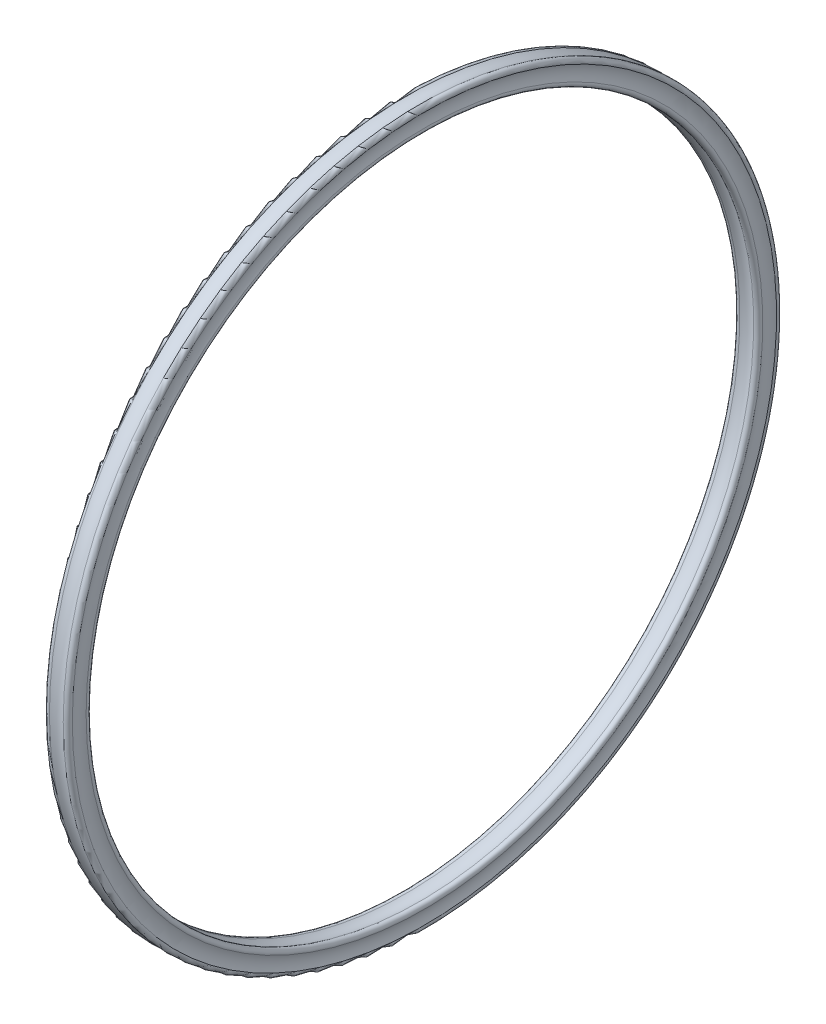
ISO-10303-21;
HEADER;
FILE_DESCRIPTION(('STEP AP214'),'2;1');
FILE_NAME('part.step','',(''),(''),'','','');
FILE_SCHEMA(('AUTOMOTIVE_DESIGN { 1 0 10303 214 1 1 1 1 }'));
ENDSEC;
DATA;
#1=APPLICATION_CONTEXT('core data for automotive mechanical design processes');
#2=APPLICATION_PROTOCOL_DEFINITION('international standard','automotive_design',2000,#1);
#3=PRODUCT_CONTEXT('',#1,'mechanical');
#4=PRODUCT('Part','Part','',(#3));
#5=PRODUCT_RELATED_PRODUCT_CATEGORY('part','',(#4));
#6=PRODUCT_DEFINITION_FORMATION('','',#4);
#7=PRODUCT_DEFINITION_CONTEXT('part definition',#1,'design');
#8=PRODUCT_DEFINITION('design','',#6,#7);
#9=PRODUCT_DEFINITION_SHAPE('','',#8);
#10=(LENGTH_UNIT() NAMED_UNIT(*) SI_UNIT(.MILLI.,.METRE.));
#11=(NAMED_UNIT(*) PLANE_ANGLE_UNIT() SI_UNIT($,.RADIAN.));
#12=(NAMED_UNIT(*) SI_UNIT($,.STERADIAN.) SOLID_ANGLE_UNIT());
#13=UNCERTAINTY_MEASURE_WITH_UNIT(LENGTH_MEASURE(1.E-05),#10,'distance_accuracy_value','');
#14=(GEOMETRIC_REPRESENTATION_CONTEXT(3) GLOBAL_UNCERTAINTY_ASSIGNED_CONTEXT((#13)) GLOBAL_UNIT_ASSIGNED_CONTEXT((#10,
#11,#12)) REPRESENTATION_CONTEXT('',''));
#15=CARTESIAN_POINT('',(0.,0.,0.));
#16=DIRECTION('',(0.,0.,1.));
#17=DIRECTION('',(1.,0.,0.));
#18=AXIS2_PLACEMENT_3D('',#15,#16,#17);
#19=CARTESIAN_POINT('',(-0.62861792847484,0.,0.));
#20=DIRECTION('',(-1.,0.,0.));
#21=DIRECTION('',(0.,0.,1.));
#22=AXIS2_PLACEMENT_3D('',#19,#20,#21);
#23=TOROIDAL_SURFACE('',#22,26.7779179284748,0.260382071525161);
#24=CARTESIAN_POINT('',(-0.8665747498208,0.,0.));
#25=DIRECTION('',(-1.,0.,0.));
#26=DIRECTION('',(0.,0.,1.));
#27=AXIS2_PLACEMENT_3D('',#24,#25,#26);
#28=CIRCLE('',#27,26.6722042853314);
#29=CARTESIAN_POINT('',(-0.8665747498208,0.,26.6722042853314));
#30=VERTEX_POINT('',#29);
#31=EDGE_CURVE('E58',#30,#30,#28,.T.);
#32=ORIENTED_EDGE('',*,*,#31,.F.);
#33=EDGE_LOOP('',(#32));
#34=FACE_BOUND('',#33,.T.);
#35=CARTESIAN_POINT('',(-0.522904285331392,0.,0.));
#36=DIRECTION('',(-1.,0.,0.));
#37=DIRECTION('',(0.,0.,1.));
#38=AXIS2_PLACEMENT_3D('',#35,#36,#37);
#39=CIRCLE('',#38,27.0158747498208);
#40=CARTESIAN_POINT('',(-0.522904285331392,0.,27.0158747498208));
#41=VERTEX_POINT('',#40);
#42=EDGE_CURVE('E10',#41,#41,#39,.T.);
#43=ORIENTED_EDGE('',*,*,#42,.T.);
#44=EDGE_LOOP('',(#43));
#45=FACE_BOUND('',#44,.T.);
#46=ADVANCED_FACE('F30',(#34,#45),#23,.T.);
#47=CARTESIAN_POINT('',(0.,0.,0.));
#48=DIRECTION('',(-1.,0.,0.));
#49=DIRECTION('',(0.,0.,1.));
#50=AXIS2_PLACEMENT_3D('',#47,#48,#49);
#51=TOROIDAL_SURFACE('',#50,28.1929095951415,1.28795959514152);
#52=ORIENTED_EDGE('',*,*,#42,.F.);
#53=EDGE_LOOP('',(#52));
#54=FACE_BOUND('',#53,.T.);
#55=CARTESIAN_POINT('',(0.522904285331394,0.,0.));
#56=DIRECTION('',(-1.,0.,0.));
#57=DIRECTION('',(0.,0.,1.));
#58=AXIS2_PLACEMENT_3D('',#55,#56,#57);
#59=CIRCLE('',#58,27.0158747498208);
#60=CARTESIAN_POINT('',(0.522904285331394,0.,27.0158747498208));
#61=VERTEX_POINT('',#60);
#62=EDGE_CURVE('E36',#61,#61,#59,.T.);
#63=ORIENTED_EDGE('',*,*,#62,.T.);
#64=EDGE_LOOP('',(#63));
#65=FACE_BOUND('',#64,.T.);
#66=ADVANCED_FACE('F65',(#54,#65),#51,.F.);
#67=CARTESIAN_POINT('',(0.628617928474841,0.,0.));
#68=DIRECTION('',(-1.,0.,0.));
#69=DIRECTION('',(0.,0.,1.));
#70=AXIS2_PLACEMENT_3D('',#67,#68,#69);
#71=TOROIDAL_SURFACE('',#70,26.7779179284748,0.260382071525159);
#72=ORIENTED_EDGE('',*,*,#62,.F.);
#73=EDGE_LOOP('',(#72));
#74=FACE_BOUND('',#73,.T.);
#75=CARTESIAN_POINT('',(0.866574749820801,0.,0.));
#76=DIRECTION('',(-1.,0.,0.));
#77=DIRECTION('',(0.,0.,1.));
#78=AXIS2_PLACEMENT_3D('',#75,#76,#77);
#79=CIRCLE('',#78,26.6722042853314);
#80=CARTESIAN_POINT('',(0.866574749820801,0.,26.6722042853314));
#81=VERTEX_POINT('',#80);
#82=EDGE_CURVE('E40',#81,#81,#79,.T.);
#83=ORIENTED_EDGE('',*,*,#82,.T.);
#84=EDGE_LOOP('',(#83));
#85=FACE_BOUND('',#84,.T.);
#86=ADVANCED_FACE('F69',(#74,#85),#71,.T.);
#87=CARTESIAN_POINT('',(2.04360959514152,0.,0.));
#88=DIRECTION('',(-1.,0.,0.));
#89=DIRECTION('',(0.,0.,1.));
#90=AXIS2_PLACEMENT_3D('',#87,#88,#89);
#91=TOROIDAL_SURFACE('',#90,26.1493,1.28795959514152);
#92=ORIENTED_EDGE('',*,*,#82,.F.);
#93=EDGE_LOOP('',(#92));
#94=FACE_BOUND('',#93,.T.);
#95=CARTESIAN_POINT('',(0.866574749820801,0.,0.));
#96=DIRECTION('',(-1.,0.,0.));
#97=DIRECTION('',(0.,0.,1.));
#98=AXIS2_PLACEMENT_3D('',#95,#96,#97);
#99=CIRCLE('',#98,25.6263957146686);
#100=CARTESIAN_POINT('',(0.866574749820801,0.,25.6263957146686));
#101=VERTEX_POINT('',#100);
#102=EDGE_CURVE('E44',#101,#101,#99,.T.);
#103=ORIENTED_EDGE('',*,*,#102,.T.);
#104=EDGE_LOOP('',(#103));
#105=FACE_BOUND('',#104,.T.);
#106=ADVANCED_FACE('F74',(#94,#105),#91,.F.);
#107=CARTESIAN_POINT('',(0.628617928474841,0.,0.));
#108=DIRECTION('',(-1.,0.,0.));
#109=DIRECTION('',(0.,0.,1.));
#110=AXIS2_PLACEMENT_3D('',#107,#108,#109);
#111=TOROIDAL_SURFACE('',#110,25.5206820715252,0.26038207152516);
#112=ORIENTED_EDGE('',*,*,#102,.F.);
#113=EDGE_LOOP('',(#112));
#114=FACE_BOUND('',#113,.T.);
#115=CARTESIAN_POINT('',(0.522904285331393,0.,0.));
#116=DIRECTION('',(-1.,0.,0.));
#117=DIRECTION('',(0.,0.,1.));
#118=AXIS2_PLACEMENT_3D('',#115,#116,#117);
#119=CIRCLE('',#118,25.2827252501792);
#120=CARTESIAN_POINT('',(0.522904285331393,0.,25.2827252501792));
#121=VERTEX_POINT('',#120);
#122=EDGE_CURVE('E49',#121,#121,#119,.T.);
#123=ORIENTED_EDGE('',*,*,#122,.T.);
#124=EDGE_LOOP('',(#123));
#125=FACE_BOUND('',#124,.T.);
#126=ADVANCED_FACE('F80',(#114,#125),#111,.T.);
#127=CARTESIAN_POINT('',(0.,0.,0.));
#128=DIRECTION('',(-1.,0.,0.));
#129=DIRECTION('',(0.,0.,1.));
#130=AXIS2_PLACEMENT_3D('',#127,#128,#129);
#131=TOROIDAL_SURFACE('',#130,24.1056904048585,1.28795959514152);
#132=ORIENTED_EDGE('',*,*,#122,.F.);
#133=EDGE_LOOP('',(#132));
#134=FACE_BOUND('',#133,.T.);
#135=CARTESIAN_POINT('',(-0.522904285331392,0.,0.));
#136=DIRECTION('',(-1.,0.,0.));
#137=DIRECTION('',(0.,0.,1.));
#138=AXIS2_PLACEMENT_3D('',#135,#136,#137);
#139=CIRCLE('',#138,25.2827252501792);
#140=CARTESIAN_POINT('',(-0.522904285331392,0.,25.2827252501792));
#141=VERTEX_POINT('',#140);
#142=EDGE_CURVE('E52',#141,#141,#139,.T.);
#143=ORIENTED_EDGE('',*,*,#142,.T.);
#144=EDGE_LOOP('',(#143));
#145=FACE_BOUND('',#144,.T.);
#146=ADVANCED_FACE('F84',(#134,#145),#131,.F.);
#147=CARTESIAN_POINT('',(-0.62861792847484,0.,0.));
#148=DIRECTION('',(-1.,0.,0.));
#149=DIRECTION('',(0.,0.,1.));
#150=AXIS2_PLACEMENT_3D('',#147,#148,#149);
#151=TOROIDAL_SURFACE('',#150,25.5206820715252,0.26038207152516);
#152=ORIENTED_EDGE('',*,*,#142,.F.);
#153=EDGE_LOOP('',(#152));
#154=FACE_BOUND('',#153,.T.);
#155=CARTESIAN_POINT('',(-0.866574749820801,0.,0.));
#156=DIRECTION('',(-1.,0.,0.));
#157=DIRECTION('',(0.,0.,1.));
#158=AXIS2_PLACEMENT_3D('',#155,#156,#157);
#159=CIRCLE('',#158,25.6263957146686);
#160=CARTESIAN_POINT('',(-0.866574749820801,0.,25.6263957146686));
#161=VERTEX_POINT('',#160);
#162=EDGE_CURVE('E55',#161,#161,#159,.T.);
#163=ORIENTED_EDGE('',*,*,#162,.T.);
#164=EDGE_LOOP('',(#163));
#165=FACE_BOUND('',#164,.T.);
#166=ADVANCED_FACE('F88',(#154,#165),#151,.T.);
#167=CARTESIAN_POINT('',(-2.04360959514153,0.,0.));
#168=DIRECTION('',(-1.,0.,0.));
#169=DIRECTION('',(0.,0.,1.));
#170=AXIS2_PLACEMENT_3D('',#167,#168,#169);
#171=TOROIDAL_SURFACE('',#170,26.1493,1.28795959514152);
#172=ORIENTED_EDGE('',*,*,#162,.F.);
#173=EDGE_LOOP('',(#172));
#174=FACE_BOUND('',#173,.T.);
#175=ORIENTED_EDGE('',*,*,#31,.T.);
#176=EDGE_LOOP('',(#175));
#177=FACE_BOUND('',#176,.T.);
#178=ADVANCED_FACE('F62',(#174,#177),#171,.F.);
#179=CLOSED_SHELL('',(#46,#66,#86,#106,#126,#146,#166,#178));
#180=MANIFOLD_SOLID_BREP('B2',#179);
#181=ADVANCED_BREP_SHAPE_REPRESENTATION('',(#18,#180),#14);
#182=SHAPE_DEFINITION_REPRESENTATION(#9,#181);
ENDSEC;
END-ISO-10303-21;
